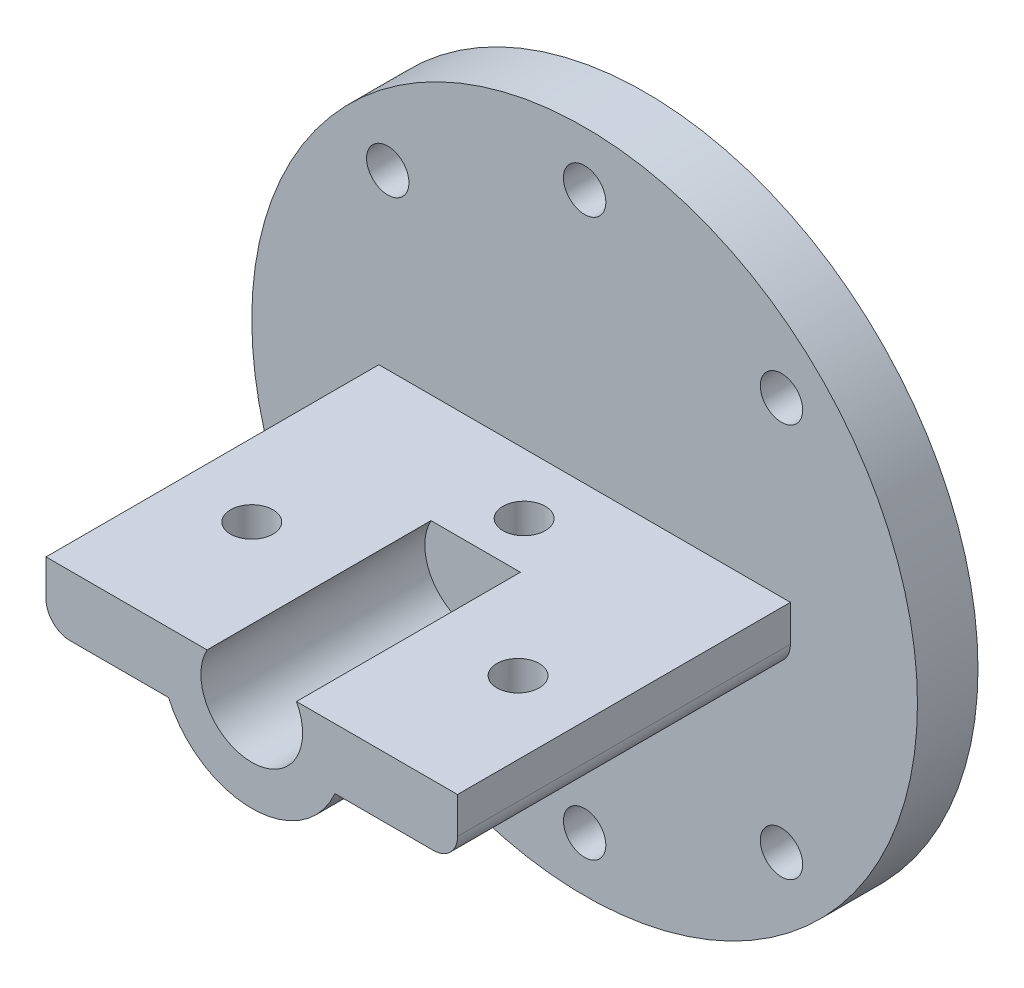
ISO-10303-21;
HEADER;
FILE_DESCRIPTION(('STEP AP214'),'2;1');
FILE_NAME('part.step','',(''),(''),'','','');
FILE_SCHEMA(('AUTOMOTIVE_DESIGN { 1 0 10303 214 1 1 1 1 }'));
ENDSEC;
DATA;
#1=APPLICATION_CONTEXT('core data for automotive mechanical design processes');
#2=APPLICATION_PROTOCOL_DEFINITION('international standard','automotive_design',2000,#1);
#3=PRODUCT_CONTEXT('',#1,'mechanical');
#4=PRODUCT('Part','Part','',(#3));
#5=PRODUCT_RELATED_PRODUCT_CATEGORY('part','',(#4));
#6=PRODUCT_DEFINITION_FORMATION('','',#4);
#7=PRODUCT_DEFINITION_CONTEXT('part definition',#1,'design');
#8=PRODUCT_DEFINITION('design','',#6,#7);
#9=PRODUCT_DEFINITION_SHAPE('','',#8);
#10=(LENGTH_UNIT() NAMED_UNIT(*) SI_UNIT(.MILLI.,.METRE.));
#11=(NAMED_UNIT(*) PLANE_ANGLE_UNIT() SI_UNIT($,.RADIAN.));
#12=(NAMED_UNIT(*) SI_UNIT($,.STERADIAN.) SOLID_ANGLE_UNIT());
#13=UNCERTAINTY_MEASURE_WITH_UNIT(LENGTH_MEASURE(1.E-05),#10,'distance_accuracy_value','');
#14=(GEOMETRIC_REPRESENTATION_CONTEXT(3) GLOBAL_UNCERTAINTY_ASSIGNED_CONTEXT((#13)) GLOBAL_UNIT_ASSIGNED_CONTEXT((#10,
#11,#12)) REPRESENTATION_CONTEXT('',''));
#15=CARTESIAN_POINT('',(0.,0.,0.));
#16=DIRECTION('',(0.,0.,1.));
#17=DIRECTION('',(1.,0.,0.));
#18=AXIS2_PLACEMENT_3D('',#15,#16,#17);
#19=CARTESIAN_POINT('',(0.,0.,5.));
#20=DIRECTION('',(0.,0.,-1.));
#21=DIRECTION('',(-1.,0.,0.));
#22=AXIS2_PLACEMENT_3D('',#19,#20,#21);
#23=PLANE('',#22);
#24=CARTESIAN_POINT('',(0.,0.,5.));
#25=DIRECTION('',(0.,0.,-1.));
#26=DIRECTION('',(-1.,0.,0.));
#27=AXIS2_PLACEMENT_3D('',#24,#25,#26);
#28=CIRCLE('',#27,27.5);
#29=CARTESIAN_POINT('',(-27.5,0.,5.));
#30=VERTEX_POINT('',#29);
#31=EDGE_CURVE('E205',#30,#30,#28,.T.);
#32=ORIENTED_EDGE('',*,*,#31,.F.);
#33=EDGE_LOOP('',(#32));
#34=FACE_BOUND('',#33,.T.);
#35=CARTESIAN_POINT('',(0.,23.,5.));
#36=DIRECTION('',(0.,0.,-1.));
#37=DIRECTION('',(-1.,0.,0.));
#38=AXIS2_PLACEMENT_3D('',#35,#36,#37);
#39=CIRCLE('',#38,1.75);
#40=CARTESIAN_POINT('',(-1.75,23.,5.));
#41=VERTEX_POINT('',#40);
#42=EDGE_CURVE('E199',#41,#41,#39,.T.);
#43=ORIENTED_EDGE('',*,*,#42,.T.);
#44=EDGE_LOOP('',(#43));
#45=FACE_BOUND('',#44,.T.);
#46=CARTESIAN_POINT('',(-16.2634559672907,16.2634559672909,5.));
#47=DIRECTION('',(0.,0.,-1.));
#48=DIRECTION('',(-1.,0.,0.));
#49=AXIS2_PLACEMENT_3D('',#46,#47,#48);
#50=CIRCLE('',#49,1.75);
#51=CARTESIAN_POINT('',(-18.0134559672907,16.2634559672909,5.));
#52=VERTEX_POINT('',#51);
#53=EDGE_CURVE('E193',#52,#52,#50,.T.);
#54=ORIENTED_EDGE('',*,*,#53,.T.);
#55=EDGE_LOOP('',(#54));
#56=FACE_BOUND('',#55,.T.);
#57=CARTESIAN_POINT('',(-16.2634559672914,-16.2634559672903,5.));
#58=DIRECTION('',(0.,0.,-1.));
#59=DIRECTION('',(-1.,0.,0.));
#60=AXIS2_PLACEMENT_3D('',#57,#58,#59);
#61=CIRCLE('',#60,1.75);
#62=CARTESIAN_POINT('',(-18.0134559672914,-16.2634559672903,5.));
#63=VERTEX_POINT('',#62);
#64=EDGE_CURVE('E187',#63,#63,#61,.T.);
#65=ORIENTED_EDGE('',*,*,#64,.T.);
#66=EDGE_LOOP('',(#65));
#67=FACE_BOUND('',#66,.T.);
#68=CARTESIAN_POINT('',(-9.57916197967052E-13,-23.,5.));
#69=DIRECTION('',(0.,0.,-1.));
#70=DIRECTION('',(-1.,0.,0.));
#71=AXIS2_PLACEMENT_3D('',#68,#69,#70);
#72=CIRCLE('',#71,1.75);
#73=CARTESIAN_POINT('',(-1.75000000000096,-23.,5.));
#74=VERTEX_POINT('',#73);
#75=EDGE_CURVE('E181',#74,#74,#72,.T.);
#76=ORIENTED_EDGE('',*,*,#75,.T.);
#77=EDGE_LOOP('',(#76));
#78=FACE_BOUND('',#77,.T.);
#79=CARTESIAN_POINT('',(16.2634559672898,-16.2634559672909,5.));
#80=DIRECTION('',(0.,0.,-1.));
#81=DIRECTION('',(-1.,0.,0.));
#82=AXIS2_PLACEMENT_3D('',#79,#80,#81);
#83=CIRCLE('',#82,1.75);
#84=CARTESIAN_POINT('',(14.5134559672898,-16.2634559672909,5.));
#85=VERTEX_POINT('',#84);
#86=EDGE_CURVE('E175',#85,#85,#83,.T.);
#87=ORIENTED_EDGE('',*,*,#86,.T.);
#88=EDGE_LOOP('',(#87));
#89=FACE_BOUND('',#88,.T.);
#90=CARTESIAN_POINT('',(16.2634559672905,16.2634559672903,5.));
#91=DIRECTION('',(0.,0.,-1.));
#92=DIRECTION('',(-1.,0.,0.));
#93=AXIS2_PLACEMENT_3D('',#90,#91,#92);
#94=CIRCLE('',#93,1.75);
#95=CARTESIAN_POINT('',(14.5134559672905,16.2634559672903,5.));
#96=VERTEX_POINT('',#95);
#97=EDGE_CURVE('E169',#96,#96,#94,.T.);
#98=ORIENTED_EDGE('',*,*,#97,.T.);
#99=EDGE_LOOP('',(#98));
#100=FACE_BOUND('',#99,.T.);
#101=DIRECTION('',(1.,0.,0.));
#102=VECTOR('',#101,1.);
#103=CARTESIAN_POINT('',(6.87386354243376,-3.,5.));
#104=LINE('',#103,#102);
#105=CARTESIAN_POINT('',(6.87386354243376,-3.,5.));
#106=VERTEX_POINT('',#105);
#107=CARTESIAN_POINT('',(15.,-3.,5.));
#108=VERTEX_POINT('',#107);
#109=EDGE_CURVE('E140',#106,#108,#104,.T.);
#110=ORIENTED_EDGE('',*,*,#109,.F.);
#111=CARTESIAN_POINT('',(0.,0.,5.));
#112=DIRECTION('',(0.,0.,-1.));
#113=DIRECTION('',(-1.,0.,0.));
#114=AXIS2_PLACEMENT_3D('',#111,#112,#113);
#115=CIRCLE('',#114,7.5);
#116=CARTESIAN_POINT('',(-6.87386354243376,-3.,5.));
#117=VERTEX_POINT('',#116);
#118=EDGE_CURVE('E215',#106,#117,#115,.T.);
#119=ORIENTED_EDGE('',*,*,#118,.T.);
#120=DIRECTION('',(1.,0.,0.));
#121=VECTOR('',#120,1.);
#122=CARTESIAN_POINT('',(-17.,-3.,5.));
#123=LINE('',#122,#121);
#124=CARTESIAN_POINT('',(-15.,-3.,5.));
#125=VERTEX_POINT('',#124);
#126=EDGE_CURVE('E145',#125,#117,#123,.T.);
#127=ORIENTED_EDGE('',*,*,#126,.F.);
#128=CARTESIAN_POINT('',(-15.,-1.,5.));
#129=DIRECTION('',(0.,0.,-1.));
#130=DIRECTION('',(-1.,0.,0.));
#131=AXIS2_PLACEMENT_3D('',#128,#129,#130);
#132=CIRCLE('',#131,2.);
#133=CARTESIAN_POINT('',(-17.,-1.,5.));
#134=VERTEX_POINT('',#133);
#135=EDGE_CURVE('E11',#125,#134,#132,.T.);
#136=ORIENTED_EDGE('',*,*,#135,.T.);
#137=DIRECTION('',(0.,-1.,0.));
#138=VECTOR('',#137,1.);
#139=CARTESIAN_POINT('',(-17.,2.,5.));
#140=LINE('',#139,#138);
#141=CARTESIAN_POINT('',(-17.,2.,5.));
#142=VERTEX_POINT('',#141);
#143=EDGE_CURVE('E148',#142,#134,#140,.T.);
#144=ORIENTED_EDGE('',*,*,#143,.F.);
#145=DIRECTION('',(1.,0.,0.));
#146=VECTOR('',#145,1.);
#147=CARTESIAN_POINT('',(-15.,2.,5.));
#148=LINE('',#147,#146);
#149=CARTESIAN_POINT('',(17.,2.,5.));
#150=VERTEX_POINT('',#149);
#151=EDGE_CURVE('E162',#142,#150,#148,.T.);
#152=ORIENTED_EDGE('',*,*,#151,.T.);
#153=DIRECTION('',(0.,1.,0.));
#154=VECTOR('',#153,1.);
#155=CARTESIAN_POINT('',(17.,-3.,5.));
#156=LINE('',#155,#154);
#157=CARTESIAN_POINT('',(17.,-1.,5.));
#158=VERTEX_POINT('',#157);
#159=EDGE_CURVE('E136',#158,#150,#156,.T.);
#160=ORIENTED_EDGE('',*,*,#159,.F.);
#161=CARTESIAN_POINT('',(15.,-1.,5.));
#162=DIRECTION('',(0.,0.,-1.));
#163=DIRECTION('',(-1.,0.,0.));
#164=AXIS2_PLACEMENT_3D('',#161,#162,#163);
#165=CIRCLE('',#164,2.);
#166=EDGE_CURVE('E40',#158,#108,#165,.T.);
#167=ORIENTED_EDGE('',*,*,#166,.T.);
#168=EDGE_LOOP('',(#110,#119,#127,#136,#144,#152,#160,#167));
#169=FACE_BOUND('',#168,.T.);
#170=ADVANCED_FACE('F32',(#34,#45,#56,#67,#78,#89,#100,#169),#23,.F.);
#171=CARTESIAN_POINT('',(0.,0.,32.5));
#172=DIRECTION('',(0.,0.,-1.));
#173=DIRECTION('',(-1.,0.,0.));
#174=AXIS2_PLACEMENT_3D('',#171,#172,#173);
#175=CYLINDRICAL_SURFACE('',#174,7.5);
#176=CARTESIAN_POINT('',(0.,-7.5,11.75));
#177=CARTESIAN_POINT('',(0.0968920689760756,-7.49999825577596,11.7499969381223));
#178=CARTESIAN_POINT('',(0.193819815225522,-7.4981034715083,11.7419259486955));
#179=CARTESIAN_POINT('',(0.384910889611755,-7.49072806388341,11.7098954233661));
#180=CARTESIAN_POINT('',(0.479072385923467,-7.48524511796865,11.6859255962732));
#181=CARTESIAN_POINT('',(0.661842669774766,-7.47130237255715,11.6228978878083));
#182=CARTESIAN_POINT('',(0.750457525699833,-7.46284589581215,11.5838568429205));
#183=CARTESIAN_POINT('',(0.91987807027651,-7.44386329828026,11.4918510425651));
#184=CARTESIAN_POINT('',(1.00068374709176,-7.43333717435647,11.4388862659938));
#185=CARTESIAN_POINT('',(1.15365744906099,-7.41115055069133,11.3195220500236));
#186=CARTESIAN_POINT('',(1.22566380724544,-7.39947439919204,11.2529183172869));
#187=CARTESIAN_POINT('',(1.35759154808836,-7.37641108271656,11.108604871122));
#188=CARTESIAN_POINT('',(1.41751172990911,-7.36502394655403,11.0308940554446));
#189=CARTESIAN_POINT('',(1.52430064665384,-7.34367214380394,10.8653499786891));
#190=CARTESIAN_POINT('',(1.57099333387897,-7.33372745319134,10.7774003445944));
#191=CARTESIAN_POINT('',(1.6488712963096,-7.31661287650471,10.5946316390806));
#192=CARTESIAN_POINT('',(1.68005870369203,-7.30944260894164,10.4998135142237));
#193=CARTESIAN_POINT('',(1.72549870554403,-7.29884882817841,10.3077642279161));
#194=CARTESIAN_POINT('',(1.74003958773343,-7.29536161619364,10.210604868876));
#195=CARTESIAN_POINT('',(1.75267090949772,-7.29233777147282,10.0151679888869));
#196=CARTESIAN_POINT('',(1.75076366258806,-7.29280058314518,9.91689062713292));
#197=CARTESIAN_POINT('',(1.73078396258508,-7.29756700759255,9.72418012856786));
#198=CARTESIAN_POINT('',(1.71305023914493,-7.30179013507032,9.62970957670082));
#199=CARTESIAN_POINT('',(1.66245929848704,-7.31347364560974,9.4451226754919));
#200=CARTESIAN_POINT('',(1.62960112866058,-7.32093423258011,9.35500660081059));
#201=CARTESIAN_POINT('',(1.54939319136076,-7.33832888287955,9.18075439387793));
#202=CARTESIAN_POINT('',(1.50191650068999,-7.34828446187752,9.0966789216871));
#203=CARTESIAN_POINT('',(1.39390822624992,-7.36953464123461,8.93756444236852));
#204=CARTESIAN_POINT('',(1.33337463263883,-7.38082944761958,8.86252682920768));
#205=CARTESIAN_POINT('',(1.19919515127698,-7.40382788817507,8.72167188592807));
#206=CARTESIAN_POINT('',(1.12526218832138,-7.41553472758942,8.65612824571926));
#207=CARTESIAN_POINT('',(0.967317488194551,-7.43778511341053,8.53832184429228));
#208=CARTESIAN_POINT('',(0.883305516240614,-7.44832863270767,8.48605939253756));
#209=CARTESIAN_POINT('',(0.707228133730521,-7.46710641661403,8.39621663530331));
#210=CARTESIAN_POINT('',(0.615141740504016,-7.47533441580223,8.35867605897876));
#211=CARTESIAN_POINT('',(0.425732018971085,-7.48850806607517,8.29968036066866));
#212=CARTESIAN_POINT('',(0.328409562882731,-7.49345426202045,8.27822256846628));
#213=CARTESIAN_POINT('',(0.133634485575037,-7.49942805503466,8.25240857958449));
#214=CARTESIAN_POINT('',(0.0362338958190522,-7.50054117979009,8.24767905714858));
#215=CARTESIAN_POINT('',(-0.157966056910929,-7.49896485478385,8.25443854328843));
#216=CARTESIAN_POINT('',(-0.254765466038352,-7.49627570064511,8.2659262909895));
#217=CARTESIAN_POINT('',(-0.443751070191777,-7.4874513357351,8.30448538128486));
#218=CARTESIAN_POINT('',(-0.535980185830076,-7.4813602349345,8.33135735996885));
#219=CARTESIAN_POINT('',(-0.71461987443014,-7.46641550234956,8.39969793420963));
#220=CARTESIAN_POINT('',(-0.801029906312502,-7.45756161410129,8.44116788491213));
#221=CARTESIAN_POINT('',(-0.967096082040951,-7.43786494800546,8.53828037693184));
#222=CARTESIAN_POINT('',(-1.04662310111654,-7.42699280446074,8.59413763315298));
#223=CARTESIAN_POINT('',(-1.19530848786501,-7.40451901177755,8.71816023470523));
#224=CARTESIAN_POINT('',(-1.26446530674697,-7.39291725403761,8.78632741518087));
#225=CARTESIAN_POINT('',(-1.39195179817296,-7.36999067066486,8.93475786942581));
#226=CARTESIAN_POINT('',(-1.45002132371627,-7.35867690401401,9.01524662849627));
#227=CARTESIAN_POINT('',(-1.55182334690519,-7.33788489047587,9.18505101455261));
#228=CARTESIAN_POINT('',(-1.59555648414632,-7.32840656171112,9.27436624752774));
#229=CARTESIAN_POINT('',(-1.66713168175486,-7.31245631829528,9.45880057499535));
#230=CARTESIAN_POINT('',(-1.69506657175421,-7.30596688379596,9.55388205225423));
#231=CARTESIAN_POINT('',(-1.73451374261782,-7.29670338236506,9.74756310468811));
#232=CARTESIAN_POINT('',(-1.74602907461822,-7.29392862516582,9.84616202274933));
#233=CARTESIAN_POINT('',(-1.75216673875871,-7.29245633350649,10.041445686875));
#234=CARTESIAN_POINT('',(-1.74720293679523,-7.29365890731389,10.138116895561));
#235=CARTESIAN_POINT('',(-1.72145838535238,-7.29977758521158,10.3292037997386));
#236=CARTESIAN_POINT('',(-1.70067787825835,-7.30469363239422,10.4236195297718));
#237=CARTESIAN_POINT('',(-1.64410189522673,-7.31763341770559,10.6071318630755));
#238=CARTESIAN_POINT('',(-1.60837453100366,-7.3256430460587,10.6962505268147));
#239=CARTESIAN_POINT('',(-1.52297483551587,-7.34387130010679,10.8672874949397));
#240=CARTESIAN_POINT('',(-1.47330082676528,-7.35409019149527,10.9492049316131));
#241=CARTESIAN_POINT('',(-1.36007929334344,-7.37587784566718,11.1055363788522));
#242=CARTESIAN_POINT('',(-1.29624027185383,-7.38747214966725,11.1797357551124));
#243=CARTESIAN_POINT('',(-1.15708154748275,-7.41054163753682,11.3165038270102));
#244=CARTESIAN_POINT('',(-1.08175916827682,-7.42201679296977,11.3790698037899));
#245=CARTESIAN_POINT('',(-0.92038922016782,-7.44376280686385,11.4917147657715));
#246=CARTESIAN_POINT('',(-0.834195898350608,-7.45401268438621,11.5415892673713));
#247=CARTESIAN_POINT('',(-0.654422829609416,-7.47193835175222,11.6260619607745));
#248=CARTESIAN_POINT('',(-0.560848945048674,-7.47961615964697,11.6606721357807));
#249=CARTESIAN_POINT('',(-0.389410230226078,-7.49026740611945,11.707925269507));
#250=CARTESIAN_POINT('',(-0.312426185720357,-7.49389343265844,11.7236714348513));
#251=CARTESIAN_POINT('',(-0.156969176166676,-7.49876036826803,11.7447097429215));
#252=CARTESIAN_POINT('',(-0.0784962961053604,-7.50000141306846,11.7500024805545));
#253=CARTESIAN_POINT('',(0.,-7.5,11.75));
#254=B_SPLINE_CURVE_WITH_KNOTS('',3,(#176,#177,#178,#179,#180,#181,#182,#183,#184,#185,#186,
#187,#188,#189,#190,#191,#192,#193,#194,#195,#196,#197,#198,#199,#200,#201,#202,#203,#204,#205,
#206,#207,#208,#209,#210,#211,#212,#213,#214,#215,#216,#217,#218,#219,#220,#221,#222,#223,#224,
#225,#226,#227,#228,#229,#230,#231,#232,#233,#234,#235,#236,#237,#238,#239,#240,#241,#242,#243,
#244,#245,#246,#247,#248,#249,#250,#251,#252,#253),.UNSPECIFIED.,.T.,.F.,(4,2,2,2,2,2,2,2,2,2,2,
2,2,2,2,2,2,2,2,2,2,2,2,2,2,2,2,2,2,2,2,2,2,2,2,2,2,2,4),(0.,0.290388732399198,0.58096561477119,
0.87121882049522,1.16147246614851,1.45644189297896,1.75144061245837,2.05019856191815,
2.34891541691671,2.64237682397785,2.93579695482906,3.22308381491298,3.51038877215024,
3.80026212118231,4.09018012214058,4.38726289257606,4.6843525846687,4.98223858898698,
5.2800751244742,5.57122135923558,5.86234495894804,6.14977863536887,6.43723900161202,
6.72926673904459,7.02133804751611,7.31959128203367,7.61783120863844,7.91429998398243,
8.21071366134324,8.49973992092952,8.78876175138095,9.07648063468675,9.36423413931506,
9.65857330060458,9.95298116608024,10.2518686566731,10.5505210872652,10.7857904701329,
11.0210464633732),.UNSPECIFIED.);
#255=CARTESIAN_POINT('',(0.,-7.5,11.75));
#256=VERTEX_POINT('',#255);
#257=EDGE_CURVE('E226',#256,#256,#254,.T.);
#258=ORIENTED_EDGE('',*,*,#257,.T.);
#259=EDGE_LOOP('',(#258));
#260=FACE_BOUND('',#259,.T.);
#261=DIRECTION('',(0.,0.,-1.));
#262=VECTOR('',#261,1.);
#263=CARTESIAN_POINT('',(6.87386354243376,-3.,43.7933006493785));
#264=LINE('',#263,#262);
#265=CARTESIAN_POINT('',(6.87386354243376,-3.,32.5));
#266=VERTEX_POINT('',#265);
#267=EDGE_CURVE('E144',#266,#106,#264,.T.);
#268=ORIENTED_EDGE('',*,*,#267,.F.);
#269=CARTESIAN_POINT('',(0.,0.,32.5));
#270=DIRECTION('',(0.,0.,1.));
#271=DIRECTION('',(1.,0.,0.));
#272=AXIS2_PLACEMENT_3D('',#269,#270,#271);
#273=CIRCLE('',#272,7.5);
#274=CARTESIAN_POINT('',(-6.87386354243376,-3.,32.5));
#275=VERTEX_POINT('',#274);
#276=EDGE_CURVE('E212',#275,#266,#273,.T.);
#277=ORIENTED_EDGE('',*,*,#276,.F.);
#278=DIRECTION('',(0.,0.,-1.));
#279=VECTOR('',#278,1.);
#280=CARTESIAN_POINT('',(-6.87386354243376,-3.,43.7933006493785));
#281=LINE('',#280,#279);
#282=EDGE_CURVE('E121',#275,#117,#281,.T.);
#283=ORIENTED_EDGE('',*,*,#282,.T.);
#284=ORIENTED_EDGE('',*,*,#118,.F.);
#285=EDGE_LOOP('',(#268,#277,#283,#284));
#286=FACE_BOUND('',#285,.T.);
#287=ADVANCED_FACE('F257',(#260,#286),#175,.T.);
#288=CARTESIAN_POINT('',(0.,0.,32.5));
#289=DIRECTION('',(0.,0.,-1.));
#290=DIRECTION('',(-1.,0.,0.));
#291=AXIS2_PLACEMENT_3D('',#288,#289,#290);
#292=CYLINDRICAL_SURFACE('',#291,4.2);
#293=CARTESIAN_POINT('',(0.,0.,14.));
#294=DIRECTION('',(0.,0.,1.));
#295=DIRECTION('',(1.,0.,0.));
#296=AXIS2_PLACEMENT_3D('',#293,#294,#295);
#297=CIRCLE('',#296,4.2);
#298=CARTESIAN_POINT('',(-3.69323706252388,2.,14.));
#299=VERTEX_POINT('',#298);
#300=CARTESIAN_POINT('',(3.69323706252388,2.,14.));
#301=VERTEX_POINT('',#300);
#302=EDGE_CURVE('E154',#299,#301,#297,.T.);
#303=ORIENTED_EDGE('',*,*,#302,.F.);
#304=DIRECTION('',(0.,0.,-1.));
#305=VECTOR('',#304,1.);
#306=CARTESIAN_POINT('',(-3.69323706252388,2.,32.5));
#307=LINE('',#306,#305);
#308=CARTESIAN_POINT('',(-3.69323706252388,2.,32.5));
#309=VERTEX_POINT('',#308);
#310=EDGE_CURVE('E165',#309,#299,#307,.T.);
#311=ORIENTED_EDGE('',*,*,#310,.F.);
#312=CARTESIAN_POINT('',(0.,0.,32.5));
#313=DIRECTION('',(0.,0.,1.));
#314=DIRECTION('',(1.,0.,0.));
#315=AXIS2_PLACEMENT_3D('',#312,#313,#314);
#316=CIRCLE('',#315,4.2);
#317=CARTESIAN_POINT('',(3.69323706252388,2.,32.5));
#318=VERTEX_POINT('',#317);
#319=EDGE_CURVE('E208',#309,#318,#316,.T.);
#320=ORIENTED_EDGE('',*,*,#319,.T.);
#321=DIRECTION('',(0.,0.,-1.));
#322=VECTOR('',#321,1.);
#323=CARTESIAN_POINT('',(3.69323706252388,2.,32.5));
#324=LINE('',#323,#322);
#325=EDGE_CURVE('E130',#301,#318,#324,.F.);
#326=ORIENTED_EDGE('',*,*,#325,.F.);
#327=EDGE_LOOP('',(#303,#311,#320,#326));
#328=FACE_BOUND('',#327,.T.);
#329=ADVANCED_FACE('F263',(#328),#292,.F.);
#330=CARTESIAN_POINT('',(0.,0.,32.5));
#331=DIRECTION('',(0.,0.,1.));
#332=DIRECTION('',(1.,0.,0.));
#333=AXIS2_PLACEMENT_3D('',#330,#331,#332);
#334=PLANE('',#333);
#335=DIRECTION('',(1.,0.,0.));
#336=VECTOR('',#335,1.);
#337=CARTESIAN_POINT('',(6.87386354243376,-3.,32.5));
#338=LINE('',#337,#336);
#339=CARTESIAN_POINT('',(15.,-3.,32.5));
#340=VERTEX_POINT('',#339);
#341=EDGE_CURVE('E122',#266,#340,#338,.T.);
#342=ORIENTED_EDGE('',*,*,#341,.T.);
#343=CARTESIAN_POINT('',(15.,-1.,32.5));
#344=DIRECTION('',(0.,0.,1.));
#345=DIRECTION('',(1.,0.,0.));
#346=AXIS2_PLACEMENT_3D('',#343,#344,#345);
#347=CIRCLE('',#346,2.);
#348=CARTESIAN_POINT('',(17.,-1.,32.5));
#349=VERTEX_POINT('',#348);
#350=EDGE_CURVE('E116',#340,#349,#347,.T.);
#351=ORIENTED_EDGE('',*,*,#350,.T.);
#352=DIRECTION('',(0.,1.,0.));
#353=VECTOR('',#352,1.);
#354=CARTESIAN_POINT('',(17.,-3.,32.5));
#355=LINE('',#354,#353);
#356=CARTESIAN_POINT('',(17.,2.,32.5));
#357=VERTEX_POINT('',#356);
#358=EDGE_CURVE('E108',#349,#357,#355,.T.);
#359=ORIENTED_EDGE('',*,*,#358,.T.);
#360=DIRECTION('',(1.,0.,0.));
#361=VECTOR('',#360,1.);
#362=CARTESIAN_POINT('',(-15.,2.,32.5));
#363=LINE('',#362,#361);
#364=EDGE_CURVE('E113',#318,#357,#363,.T.);
#365=ORIENTED_EDGE('',*,*,#364,.F.);
#366=ORIENTED_EDGE('',*,*,#319,.F.);
#367=CARTESIAN_POINT('',(-17.,2.,32.5));
#368=VERTEX_POINT('',#367);
#369=EDGE_CURVE('E131',#368,#309,#363,.T.);
#370=ORIENTED_EDGE('',*,*,#369,.F.);
#371=DIRECTION('',(0.,-1.,0.));
#372=VECTOR('',#371,1.);
#373=CARTESIAN_POINT('',(-17.,2.,32.5));
#374=LINE('',#373,#372);
#375=CARTESIAN_POINT('',(-17.,-1.,32.5));
#376=VERTEX_POINT('',#375);
#377=EDGE_CURVE('E151',#368,#376,#374,.T.);
#378=ORIENTED_EDGE('',*,*,#377,.T.);
#379=CARTESIAN_POINT('',(-15.,-1.,32.5));
#380=DIRECTION('',(0.,0.,1.));
#381=DIRECTION('',(1.,0.,0.));
#382=AXIS2_PLACEMENT_3D('',#379,#380,#381);
#383=CIRCLE('',#382,2.);
#384=CARTESIAN_POINT('',(-15.,-3.,32.5));
#385=VERTEX_POINT('',#384);
#386=EDGE_CURVE('E230',#376,#385,#383,.T.);
#387=ORIENTED_EDGE('',*,*,#386,.T.);
#388=DIRECTION('',(1.,0.,0.));
#389=VECTOR('',#388,1.);
#390=CARTESIAN_POINT('',(-17.,-3.,32.5));
#391=LINE('',#390,#389);
#392=EDGE_CURVE('E147',#385,#275,#391,.T.);
#393=ORIENTED_EDGE('',*,*,#392,.T.);
#394=ORIENTED_EDGE('',*,*,#276,.T.);
#395=EDGE_LOOP('',(#342,#351,#359,#365,#366,#370,#378,#387,#393,#394));
#396=FACE_BOUND('',#395,.T.);
#397=ADVANCED_FACE('F111',(#396),#334,.T.);
#398=CARTESIAN_POINT('',(0.,0.,0.));
#399=DIRECTION('',(0.,0.,1.));
#400=DIRECTION('',(1.,0.,0.));
#401=AXIS2_PLACEMENT_3D('',#398,#399,#400);
#402=PLANE('',#401);
#403=CARTESIAN_POINT('',(16.2634559672905,16.2634559672903,0.));
#404=DIRECTION('',(0.,0.,-1.));
#405=DIRECTION('',(-1.,0.,0.));
#406=AXIS2_PLACEMENT_3D('',#403,#404,#405);
#407=CIRCLE('',#406,1.75);
#408=CARTESIAN_POINT('',(14.5134559672905,16.2634559672903,0.));
#409=VERTEX_POINT('',#408);
#410=EDGE_CURVE('E168',#409,#409,#407,.T.);
#411=ORIENTED_EDGE('',*,*,#410,.F.);
#412=EDGE_LOOP('',(#411));
#413=FACE_BOUND('',#412,.T.);
#414=CARTESIAN_POINT('',(16.2634559672898,-16.2634559672909,0.));
#415=DIRECTION('',(0.,0.,-1.));
#416=DIRECTION('',(-1.,0.,0.));
#417=AXIS2_PLACEMENT_3D('',#414,#415,#416);
#418=CIRCLE('',#417,1.75);
#419=CARTESIAN_POINT('',(14.5134559672898,-16.2634559672909,0.));
#420=VERTEX_POINT('',#419);
#421=EDGE_CURVE('E172',#420,#420,#418,.T.);
#422=ORIENTED_EDGE('',*,*,#421,.F.);
#423=EDGE_LOOP('',(#422));
#424=FACE_BOUND('',#423,.T.);
#425=CARTESIAN_POINT('',(-9.57916197967052E-13,-23.,0.));
#426=DIRECTION('',(0.,0.,-1.));
#427=DIRECTION('',(-1.,0.,0.));
#428=AXIS2_PLACEMENT_3D('',#425,#426,#427);
#429=CIRCLE('',#428,1.75);
#430=CARTESIAN_POINT('',(-1.75000000000096,-23.,0.));
#431=VERTEX_POINT('',#430);
#432=EDGE_CURVE('E178',#431,#431,#429,.T.);
#433=ORIENTED_EDGE('',*,*,#432,.F.);
#434=EDGE_LOOP('',(#433));
#435=FACE_BOUND('',#434,.T.);
#436=CARTESIAN_POINT('',(-16.2634559672914,-16.2634559672903,0.));
#437=DIRECTION('',(0.,0.,-1.));
#438=DIRECTION('',(-1.,0.,0.));
#439=AXIS2_PLACEMENT_3D('',#436,#437,#438);
#440=CIRCLE('',#439,1.75);
#441=CARTESIAN_POINT('',(-18.0134559672914,-16.2634559672903,0.));
#442=VERTEX_POINT('',#441);
#443=EDGE_CURVE('E184',#442,#442,#440,.T.);
#444=ORIENTED_EDGE('',*,*,#443,.F.);
#445=EDGE_LOOP('',(#444));
#446=FACE_BOUND('',#445,.T.);
#447=CARTESIAN_POINT('',(-16.2634559672907,16.2634559672909,0.));
#448=DIRECTION('',(0.,0.,-1.));
#449=DIRECTION('',(-1.,0.,0.));
#450=AXIS2_PLACEMENT_3D('',#447,#448,#449);
#451=CIRCLE('',#450,1.75);
#452=CARTESIAN_POINT('',(-18.0134559672907,16.2634559672909,0.));
#453=VERTEX_POINT('',#452);
#454=EDGE_CURVE('E190',#453,#453,#451,.T.);
#455=ORIENTED_EDGE('',*,*,#454,.F.);
#456=EDGE_LOOP('',(#455));
#457=FACE_BOUND('',#456,.T.);
#458=CARTESIAN_POINT('',(0.,23.,0.));
#459=DIRECTION('',(0.,0.,-1.));
#460=DIRECTION('',(-1.,0.,0.));
#461=AXIS2_PLACEMENT_3D('',#458,#459,#460);
#462=CIRCLE('',#461,1.75);
#463=CARTESIAN_POINT('',(-1.75,23.,0.));
#464=VERTEX_POINT('',#463);
#465=EDGE_CURVE('E196',#464,#464,#462,.T.);
#466=ORIENTED_EDGE('',*,*,#465,.F.);
#467=EDGE_LOOP('',(#466));
#468=FACE_BOUND('',#467,.T.);
#469=CARTESIAN_POINT('',(0.,0.,0.));
#470=DIRECTION('',(0.,0.,-1.));
#471=DIRECTION('',(-1.,0.,0.));
#472=AXIS2_PLACEMENT_3D('',#469,#470,#471);
#473=CIRCLE('',#472,27.5);
#474=CARTESIAN_POINT('',(-27.5,0.,0.));
#475=VERTEX_POINT('',#474);
#476=EDGE_CURVE('E202',#475,#475,#473,.T.);
#477=ORIENTED_EDGE('',*,*,#476,.T.);
#478=EDGE_LOOP('',(#477));
#479=FACE_BOUND('',#478,.T.);
#480=ADVANCED_FACE('F274',(#413,#424,#435,#446,#457,#468,#479),#402,.F.);
#481=CARTESIAN_POINT('',(0.,0.,5.));
#482=DIRECTION('',(0.,0.,-1.));
#483=DIRECTION('',(-1.,0.,0.));
#484=AXIS2_PLACEMENT_3D('',#481,#482,#483);
#485=CYLINDRICAL_SURFACE('',#484,27.5);
#486=ORIENTED_EDGE('',*,*,#31,.T.);
#487=EDGE_LOOP('',(#486));
#488=FACE_BOUND('',#487,.T.);
#489=ORIENTED_EDGE('',*,*,#476,.F.);
#490=EDGE_LOOP('',(#489));
#491=FACE_BOUND('',#490,.T.);
#492=ADVANCED_FACE('F271',(#488,#491),#485,.T.);
#493=CARTESIAN_POINT('',(0.,23.,5.));
#494=DIRECTION('',(0.,0.,-1.));
#495=DIRECTION('',(-1.,0.,0.));
#496=AXIS2_PLACEMENT_3D('',#493,#494,#495);
#497=CYLINDRICAL_SURFACE('',#496,1.75);
#498=ORIENTED_EDGE('',*,*,#42,.F.);
#499=EDGE_LOOP('',(#498));
#500=FACE_BOUND('',#499,.T.);
#501=ORIENTED_EDGE('',*,*,#465,.T.);
#502=EDGE_LOOP('',(#501));
#503=FACE_BOUND('',#502,.T.);
#504=ADVANCED_FACE('F269',(#500,#503),#497,.F.);
#505=CARTESIAN_POINT('',(-16.2634559672907,16.2634559672909,5.));
#506=DIRECTION('',(0.,0.,-1.));
#507=DIRECTION('',(-1.,0.,0.));
#508=AXIS2_PLACEMENT_3D('',#505,#506,#507);
#509=CYLINDRICAL_SURFACE('',#508,1.75);
#510=ORIENTED_EDGE('',*,*,#53,.F.);
#511=EDGE_LOOP('',(#510));
#512=FACE_BOUND('',#511,.T.);
#513=ORIENTED_EDGE('',*,*,#454,.T.);
#514=EDGE_LOOP('',(#513));
#515=FACE_BOUND('',#514,.T.);
#516=ADVANCED_FACE('F335',(#512,#515),#509,.F.);
#517=CARTESIAN_POINT('',(-16.2634559672914,-16.2634559672903,5.));
#518=DIRECTION('',(0.,0.,-1.));
#519=DIRECTION('',(-1.,0.,0.));
#520=AXIS2_PLACEMENT_3D('',#517,#518,#519);
#521=CYLINDRICAL_SURFACE('',#520,1.75);
#522=ORIENTED_EDGE('',*,*,#64,.F.);
#523=EDGE_LOOP('',(#522));
#524=FACE_BOUND('',#523,.T.);
#525=ORIENTED_EDGE('',*,*,#443,.T.);
#526=EDGE_LOOP('',(#525));
#527=FACE_BOUND('',#526,.T.);
#528=ADVANCED_FACE('F332',(#524,#527),#521,.F.);
#529=CARTESIAN_POINT('',(-9.57916197967052E-13,-23.,5.));
#530=DIRECTION('',(0.,0.,-1.));
#531=DIRECTION('',(-1.,0.,0.));
#532=AXIS2_PLACEMENT_3D('',#529,#530,#531);
#533=CYLINDRICAL_SURFACE('',#532,1.75);
#534=ORIENTED_EDGE('',*,*,#75,.F.);
#535=EDGE_LOOP('',(#534));
#536=FACE_BOUND('',#535,.T.);
#537=ORIENTED_EDGE('',*,*,#432,.T.);
#538=EDGE_LOOP('',(#537));
#539=FACE_BOUND('',#538,.T.);
#540=ADVANCED_FACE('F328',(#536,#539),#533,.F.);
#541=CARTESIAN_POINT('',(16.2634559672898,-16.2634559672909,5.));
#542=DIRECTION('',(0.,0.,-1.));
#543=DIRECTION('',(-1.,0.,0.));
#544=AXIS2_PLACEMENT_3D('',#541,#542,#543);
#545=CYLINDRICAL_SURFACE('',#544,1.75);
#546=ORIENTED_EDGE('',*,*,#86,.F.);
#547=EDGE_LOOP('',(#546));
#548=FACE_BOUND('',#547,.T.);
#549=ORIENTED_EDGE('',*,*,#421,.T.);
#550=EDGE_LOOP('',(#549));
#551=FACE_BOUND('',#550,.T.);
#552=ADVANCED_FACE('F324',(#548,#551),#545,.F.);
#553=CARTESIAN_POINT('',(16.2634559672905,16.2634559672903,5.));
#554=DIRECTION('',(0.,0.,-1.));
#555=DIRECTION('',(-1.,0.,0.));
#556=AXIS2_PLACEMENT_3D('',#553,#554,#555);
#557=CYLINDRICAL_SURFACE('',#556,1.75);
#558=ORIENTED_EDGE('',*,*,#97,.F.);
#559=EDGE_LOOP('',(#558));
#560=FACE_BOUND('',#559,.T.);
#561=ORIENTED_EDGE('',*,*,#410,.T.);
#562=EDGE_LOOP('',(#561));
#563=FACE_BOUND('',#562,.T.);
#564=ADVANCED_FACE('F320',(#560,#563),#557,.F.);
#565=CARTESIAN_POINT('',(-15.,2.,-22.6586333718787));
#566=DIRECTION('',(0.,-1.,0.));
#567=DIRECTION('',(0.,0.,-1.));
#568=AXIS2_PLACEMENT_3D('',#565,#566,#567);
#569=PLANE('',#568);
#570=CARTESIAN_POINT('',(0.,2.,10.));
#571=DIRECTION('',(0.,1.,0.));
#572=DIRECTION('',(0.,0.,1.));
#573=AXIS2_PLACEMENT_3D('',#570,#571,#572);
#574=CIRCLE('',#573,1.75);
#575=CARTESIAN_POINT('',(0.,2.,11.75));
#576=VERTEX_POINT('',#575);
#577=EDGE_CURVE('E223',#576,#576,#574,.T.);
#578=ORIENTED_EDGE('',*,*,#577,.F.);
#579=EDGE_LOOP('',(#578));
#580=FACE_BOUND('',#579,.T.);
#581=CARTESIAN_POINT('',(-11.,2.,21.5));
#582=DIRECTION('',(0.,1.,0.));
#583=DIRECTION('',(0.,0.,1.));
#584=AXIS2_PLACEMENT_3D('',#581,#582,#583);
#585=CIRCLE('',#584,1.75000000000001);
#586=CARTESIAN_POINT('',(-11.,2.,23.25));
#587=VERTEX_POINT('',#586);
#588=EDGE_CURVE('E542',#587,#587,#585,.T.);
#589=ORIENTED_EDGE('',*,*,#588,.F.);
#590=EDGE_LOOP('',(#589));
#591=FACE_BOUND('',#590,.T.);
#592=CARTESIAN_POINT('',(11.,2.,21.5));
#593=DIRECTION('',(0.,1.,0.));
#594=DIRECTION('',(0.,0.,1.));
#595=AXIS2_PLACEMENT_3D('',#592,#593,#594);
#596=CIRCLE('',#595,1.75);
#597=CARTESIAN_POINT('',(11.,2.,23.25));
#598=VERTEX_POINT('',#597);
#599=EDGE_CURVE('E290',#598,#598,#596,.T.);
#600=ORIENTED_EDGE('',*,*,#599,.F.);
#601=EDGE_LOOP('',(#600));
#602=FACE_BOUND('',#601,.T.);
#603=ORIENTED_EDGE('',*,*,#369,.T.);
#604=ORIENTED_EDGE('',*,*,#310,.T.);
#605=DIRECTION('',(-1.,0.,0.));
#606=VECTOR('',#605,1.);
#607=CARTESIAN_POINT('',(-3.69323706252388,2.,14.));
#608=LINE('',#607,#606);
#609=EDGE_CURVE('E132',#301,#299,#608,.T.);
#610=ORIENTED_EDGE('',*,*,#609,.F.);
#611=ORIENTED_EDGE('',*,*,#325,.T.);
#612=ORIENTED_EDGE('',*,*,#364,.T.);
#613=DIRECTION('',(0.,0.,-1.));
#614=VECTOR('',#613,1.);
#615=CARTESIAN_POINT('',(17.,2.,43.7933006493785));
#616=LINE('',#615,#614);
#617=EDGE_CURVE('E127',#357,#150,#616,.T.);
#618=ORIENTED_EDGE('',*,*,#617,.T.);
#619=ORIENTED_EDGE('',*,*,#151,.F.);
#620=DIRECTION('',(0.,0.,-1.));
#621=VECTOR('',#620,1.);
#622=CARTESIAN_POINT('',(-17.,2.,43.7933006493785));
#623=LINE('',#622,#621);
#624=EDGE_CURVE('E150',#368,#142,#623,.T.);
#625=ORIENTED_EDGE('',*,*,#624,.F.);
#626=EDGE_LOOP('',(#603,#604,#610,#611,#612,#618,#619,#625));
#627=FACE_BOUND('',#626,.T.);
#628=ADVANCED_FACE('F126',(#580,#591,#602,#627),#569,.F.);
#629=CARTESIAN_POINT('',(0.,0.,14.));
#630=DIRECTION('',(0.,0.,1.));
#631=DIRECTION('',(1.,0.,0.));
#632=AXIS2_PLACEMENT_3D('',#629,#630,#631);
#633=PLANE('',#632);
#634=ORIENTED_EDGE('',*,*,#302,.T.);
#635=ORIENTED_EDGE('',*,*,#609,.T.);
#636=EDGE_LOOP('',(#634,#635));
#637=FACE_BOUND('',#636,.T.);
#638=ADVANCED_FACE('F313',(#637),#633,.T.);
#639=CARTESIAN_POINT('',(-17.,2.,43.7933006493785));
#640=DIRECTION('',(1.,0.,0.));
#641=DIRECTION('',(0.,0.,-1.));
#642=AXIS2_PLACEMENT_3D('',#639,#640,#641);
#643=PLANE('',#642);
#644=ORIENTED_EDGE('',*,*,#143,.T.);
#645=DIRECTION('',(0.,0.,-1.));
#646=VECTOR('',#645,1.);
#647=CARTESIAN_POINT('',(-17.,-1.,43.7933006493785));
#648=LINE('',#647,#646);
#649=EDGE_CURVE('E235',#134,#376,#648,.F.);
#650=ORIENTED_EDGE('',*,*,#649,.T.);
#651=ORIENTED_EDGE('',*,*,#377,.F.);
#652=ORIENTED_EDGE('',*,*,#624,.T.);
#653=EDGE_LOOP('',(#644,#650,#651,#652));
#654=FACE_BOUND('',#653,.T.);
#655=ADVANCED_FACE('F309',(#654),#643,.F.);
#656=CARTESIAN_POINT('',(-17.,-3.,43.7933006493785));
#657=DIRECTION('',(0.,1.,0.));
#658=DIRECTION('',(-1.,0.,0.));
#659=AXIS2_PLACEMENT_3D('',#656,#657,#658);
#660=PLANE('',#659);
#661=CARTESIAN_POINT('',(-11.,-3.,21.5));
#662=DIRECTION('',(0.,1.,0.));
#663=DIRECTION('',(-1.,0.,0.));
#664=AXIS2_PLACEMENT_3D('',#661,#662,#663);
#665=CIRCLE('',#664,1.75000000000001);
#666=CARTESIAN_POINT('',(-12.75,-3.,21.5));
#667=VERTEX_POINT('',#666);
#668=EDGE_CURVE('E222',#667,#667,#665,.T.);
#669=ORIENTED_EDGE('',*,*,#668,.T.);
#670=EDGE_LOOP('',(#669));
#671=FACE_BOUND('',#670,.T.);
#672=ORIENTED_EDGE('',*,*,#392,.F.);
#673=DIRECTION('',(0.,0.,-1.));
#674=VECTOR('',#673,1.);
#675=CARTESIAN_POINT('',(-15.,-3.,43.7933006493785));
#676=LINE('',#675,#674);
#677=EDGE_CURVE('E233',#385,#125,#676,.T.);
#678=ORIENTED_EDGE('',*,*,#677,.T.);
#679=ORIENTED_EDGE('',*,*,#126,.T.);
#680=ORIENTED_EDGE('',*,*,#282,.F.);
#681=EDGE_LOOP('',(#672,#678,#679,#680));
#682=FACE_BOUND('',#681,.T.);
#683=ADVANCED_FACE('F305',(#671,#682),#660,.F.);
#684=CARTESIAN_POINT('',(6.87386354243376,-3.,43.7933006493785));
#685=DIRECTION('',(0.,1.,0.));
#686=DIRECTION('',(-1.,0.,0.));
#687=AXIS2_PLACEMENT_3D('',#684,#685,#686);
#688=PLANE('',#687);
#689=CARTESIAN_POINT('',(11.,-3.,21.5));
#690=DIRECTION('',(0.,1.,0.));
#691=DIRECTION('',(-1.,0.,0.));
#692=AXIS2_PLACEMENT_3D('',#689,#690,#691);
#693=CIRCLE('',#692,1.75);
#694=CARTESIAN_POINT('',(9.25,-3.,21.5));
#695=VERTEX_POINT('',#694);
#696=EDGE_CURVE('E219',#695,#695,#693,.T.);
#697=ORIENTED_EDGE('',*,*,#696,.T.);
#698=EDGE_LOOP('',(#697));
#699=FACE_BOUND('',#698,.T.);
#700=ORIENTED_EDGE('',*,*,#109,.T.);
#701=DIRECTION('',(0.,0.,-1.));
#702=VECTOR('',#701,1.);
#703=CARTESIAN_POINT('',(15.,-3.,43.7933006493785));
#704=LINE('',#703,#702);
#705=EDGE_CURVE('E228',#108,#340,#704,.F.);
#706=ORIENTED_EDGE('',*,*,#705,.T.);
#707=ORIENTED_EDGE('',*,*,#341,.F.);
#708=ORIENTED_EDGE('',*,*,#267,.T.);
#709=EDGE_LOOP('',(#700,#706,#707,#708));
#710=FACE_BOUND('',#709,.T.);
#711=ADVANCED_FACE('F242',(#699,#710),#688,.F.);
#712=CARTESIAN_POINT('',(17.,-3.,43.7933006493785));
#713=DIRECTION('',(-1.,0.,0.));
#714=DIRECTION('',(0.,0.,1.));
#715=AXIS2_PLACEMENT_3D('',#712,#713,#714);
#716=PLANE('',#715);
#717=ORIENTED_EDGE('',*,*,#358,.F.);
#718=DIRECTION('',(0.,0.,-1.));
#719=VECTOR('',#718,1.);
#720=CARTESIAN_POINT('',(17.,-1.,43.7933006493785));
#721=LINE('',#720,#719);
#722=EDGE_CURVE('E218',#349,#158,#721,.T.);
#723=ORIENTED_EDGE('',*,*,#722,.T.);
#724=ORIENTED_EDGE('',*,*,#159,.T.);
#725=ORIENTED_EDGE('',*,*,#617,.F.);
#726=EDGE_LOOP('',(#717,#723,#724,#725));
#727=FACE_BOUND('',#726,.T.);
#728=ADVANCED_FACE('F134',(#727),#716,.F.);
#729=CARTESIAN_POINT('',(11.,-27.5,21.5));
#730=DIRECTION('',(0.,1.,0.));
#731=DIRECTION('',(0.,0.,1.));
#732=AXIS2_PLACEMENT_3D('',#729,#730,#731);
#733=CYLINDRICAL_SURFACE('',#732,1.75);
#734=ORIENTED_EDGE('',*,*,#599,.T.);
#735=EDGE_LOOP('',(#734));
#736=FACE_BOUND('',#735,.T.);
#737=ORIENTED_EDGE('',*,*,#696,.F.);
#738=EDGE_LOOP('',(#737));
#739=FACE_BOUND('',#738,.T.);
#740=ADVANCED_FACE('F296',(#736,#739),#733,.F.);
#741=CARTESIAN_POINT('',(-11.,-27.5,21.5));
#742=DIRECTION('',(0.,1.,0.));
#743=DIRECTION('',(0.,0.,1.));
#744=AXIS2_PLACEMENT_3D('',#741,#742,#743);
#745=CYLINDRICAL_SURFACE('',#744,1.75000000000001);
#746=ORIENTED_EDGE('',*,*,#588,.T.);
#747=EDGE_LOOP('',(#746));
#748=FACE_BOUND('',#747,.T.);
#749=ORIENTED_EDGE('',*,*,#668,.F.);
#750=EDGE_LOOP('',(#749));
#751=FACE_BOUND('',#750,.T.);
#752=ADVANCED_FACE('F252',(#748,#751),#745,.F.);
#753=CARTESIAN_POINT('',(0.,-27.5,10.));
#754=DIRECTION('',(0.,1.,0.));
#755=DIRECTION('',(0.,0.,1.));
#756=AXIS2_PLACEMENT_3D('',#753,#754,#755);
#757=CYLINDRICAL_SURFACE('',#756,1.75);
#758=ORIENTED_EDGE('',*,*,#577,.T.);
#759=EDGE_LOOP('',(#758));
#760=FACE_BOUND('',#759,.T.);
#761=ORIENTED_EDGE('',*,*,#257,.F.);
#762=EDGE_LOOP('',(#761));
#763=FACE_BOUND('',#762,.T.);
#764=ADVANCED_FACE('F247',(#760,#763),#757,.F.);
#765=CARTESIAN_POINT('',(15.,-1.,43.7933006493785));
#766=DIRECTION('',(0.,0.,-1.));
#767=DIRECTION('',(-1.,0.,0.));
#768=AXIS2_PLACEMENT_3D('',#765,#766,#767);
#769=CYLINDRICAL_SURFACE('',#768,2.);
#770=ORIENTED_EDGE('',*,*,#350,.F.);
#771=ORIENTED_EDGE('',*,*,#705,.F.);
#772=ORIENTED_EDGE('',*,*,#166,.F.);
#773=ORIENTED_EDGE('',*,*,#722,.F.);
#774=EDGE_LOOP('',(#770,#771,#772,#773));
#775=FACE_BOUND('',#774,.T.);
#776=ADVANCED_FACE('F245',(#775),#769,.T.);
#777=CARTESIAN_POINT('',(-15.,-1.,43.7933006493785));
#778=DIRECTION('',(0.,0.,-1.));
#779=DIRECTION('',(-1.,0.,0.));
#780=AXIS2_PLACEMENT_3D('',#777,#778,#779);
#781=CYLINDRICAL_SURFACE('',#780,2.);
#782=ORIENTED_EDGE('',*,*,#386,.F.);
#783=ORIENTED_EDGE('',*,*,#649,.F.);
#784=ORIENTED_EDGE('',*,*,#135,.F.);
#785=ORIENTED_EDGE('',*,*,#677,.F.);
#786=EDGE_LOOP('',(#782,#783,#784,#785));
#787=FACE_BOUND('',#786,.T.);
#788=ADVANCED_FACE('F34',(#787),#781,.T.);
#789=CLOSED_SHELL('',(#170,#287,#329,#397,#480,#492,#504,#516,#528,#540,#552,#564,#628,#638,
#655,#683,#711,#728,#740,#752,#764,#776,#788));
#790=MANIFOLD_SOLID_BREP('B2',#789);
#791=ADVANCED_BREP_SHAPE_REPRESENTATION('',(#18,#790),#14);
#792=SHAPE_DEFINITION_REPRESENTATION(#9,#791);
ENDSEC;
END-ISO-10303-21;
